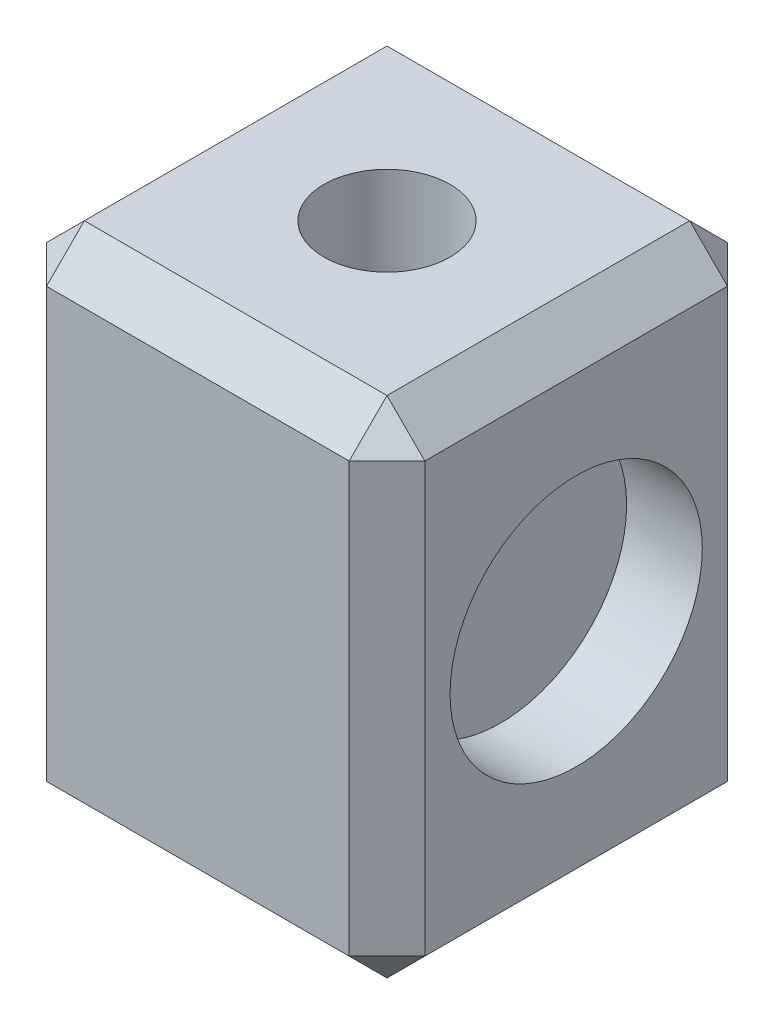
ISO-10303-21;
HEADER;
FILE_DESCRIPTION(('STEP AP214'),'2;1');
FILE_NAME('part.step','',(''),(''),'','','');
FILE_SCHEMA(('AUTOMOTIVE_DESIGN { 1 0 10303 214 1 1 1 1 }'));
ENDSEC;
DATA;
#1=APPLICATION_CONTEXT('core data for automotive mechanical design processes');
#2=APPLICATION_PROTOCOL_DEFINITION('international standard','automotive_design',2000,#1);
#3=PRODUCT_CONTEXT('',#1,'mechanical');
#4=PRODUCT('Part','Part','',(#3));
#5=PRODUCT_RELATED_PRODUCT_CATEGORY('part','',(#4));
#6=PRODUCT_DEFINITION_FORMATION('','',#4);
#7=PRODUCT_DEFINITION_CONTEXT('part definition',#1,'design');
#8=PRODUCT_DEFINITION('design','',#6,#7);
#9=PRODUCT_DEFINITION_SHAPE('','',#8);
#10=(LENGTH_UNIT() NAMED_UNIT(*) SI_UNIT(.MILLI.,.METRE.));
#11=(NAMED_UNIT(*) PLANE_ANGLE_UNIT() SI_UNIT($,.RADIAN.));
#12=(NAMED_UNIT(*) SI_UNIT($,.STERADIAN.) SOLID_ANGLE_UNIT());
#13=UNCERTAINTY_MEASURE_WITH_UNIT(LENGTH_MEASURE(1.E-05),#10,'distance_accuracy_value','');
#14=(GEOMETRIC_REPRESENTATION_CONTEXT(3) GLOBAL_UNCERTAINTY_ASSIGNED_CONTEXT((#13)) GLOBAL_UNIT_ASSIGNED_CONTEXT((#10,
#11,#12)) REPRESENTATION_CONTEXT('',''));
#15=CARTESIAN_POINT('',(0.,0.,0.));
#16=DIRECTION('',(0.,0.,1.));
#17=DIRECTION('',(1.,0.,0.));
#18=AXIS2_PLACEMENT_3D('',#15,#16,#17);
#19=CARTESIAN_POINT('',(0.,50.8,0.));
#20=DIRECTION('',(0.,-1.,0.));
#21=DIRECTION('',(0.,0.,-1.));
#22=AXIS2_PLACEMENT_3D('',#19,#20,#21);
#23=PLANE('',#22);
#24=DIRECTION('',(-1.,0.,0.));
#25=VECTOR('',#24,1.);
#26=CARTESIAN_POINT('',(0.,50.8,-15.24));
#27=LINE('',#26,#25);
#28=CARTESIAN_POINT('',(15.24,50.8,-15.24));
#29=VERTEX_POINT('',#28);
#30=CARTESIAN_POINT('',(-15.24,50.8,-15.24));
#31=VERTEX_POINT('',#30);
#32=EDGE_CURVE('E201',#29,#31,#27,.T.);
#33=ORIENTED_EDGE('',*,*,#32,.T.);
#34=DIRECTION('',(0.,0.,1.));
#35=VECTOR('',#34,1.);
#36=CARTESIAN_POINT('',(-15.24,50.8,0.));
#37=LINE('',#36,#35);
#38=CARTESIAN_POINT('',(-15.24,50.8,15.24));
#39=VERTEX_POINT('',#38);
#40=EDGE_CURVE('E11',#31,#39,#37,.T.);
#41=ORIENTED_EDGE('',*,*,#40,.T.);
#42=DIRECTION('',(1.,0.,0.));
#43=VECTOR('',#42,1.);
#44=CARTESIAN_POINT('',(0.,50.8,15.24));
#45=LINE('',#44,#43);
#46=CARTESIAN_POINT('',(15.24,50.8,15.24));
#47=VERTEX_POINT('',#46);
#48=EDGE_CURVE('E44',#39,#47,#45,.T.);
#49=ORIENTED_EDGE('',*,*,#48,.T.);
#50=DIRECTION('',(0.,0.,-1.));
#51=VECTOR('',#50,1.);
#52=CARTESIAN_POINT('',(15.24,50.8,0.));
#53=LINE('',#52,#51);
#54=EDGE_CURVE('E203',#47,#29,#53,.T.);
#55=ORIENTED_EDGE('',*,*,#54,.T.);
#56=EDGE_LOOP('',(#33,#41,#49,#55));
#57=FACE_BOUND('',#56,.T.);
#58=CARTESIAN_POINT('',(0.,50.8,0.));
#59=DIRECTION('',(0.,1.,0.));
#60=DIRECTION('',(0.,0.,1.));
#61=AXIS2_PLACEMENT_3D('',#58,#59,#60);
#62=CIRCLE('',#61,6.35);
#63=CARTESIAN_POINT('',(0.,50.8,6.35));
#64=VERTEX_POINT('',#63);
#65=EDGE_CURVE('E157',#64,#64,#62,.T.);
#66=ORIENTED_EDGE('',*,*,#65,.F.);
#67=EDGE_LOOP('',(#66));
#68=FACE_BOUND('',#67,.T.);
#69=ADVANCED_FACE('F34',(#57,#68),#23,.F.);
#70=CARTESIAN_POINT('',(0.,0.,0.));
#71=DIRECTION('',(0.,-1.,0.));
#72=DIRECTION('',(0.,0.,-1.));
#73=AXIS2_PLACEMENT_3D('',#70,#71,#72);
#74=PLANE('',#73);
#75=DIRECTION('',(0.,0.,1.));
#76=VECTOR('',#75,1.);
#77=CARTESIAN_POINT('',(15.24,0.,19.05));
#78=LINE('',#77,#76);
#79=CARTESIAN_POINT('',(15.24,0.,-15.24));
#80=VERTEX_POINT('',#79);
#81=CARTESIAN_POINT('',(15.24,0.,15.24));
#82=VERTEX_POINT('',#81);
#83=EDGE_CURVE('E165',#80,#82,#78,.T.);
#84=ORIENTED_EDGE('',*,*,#83,.T.);
#85=DIRECTION('',(-1.,0.,0.));
#86=VECTOR('',#85,1.);
#87=CARTESIAN_POINT('',(-19.05,0.,15.24));
#88=LINE('',#87,#86);
#89=CARTESIAN_POINT('',(-15.24,0.,15.24));
#90=VERTEX_POINT('',#89);
#91=EDGE_CURVE('E134',#82,#90,#88,.T.);
#92=ORIENTED_EDGE('',*,*,#91,.T.);
#93=DIRECTION('',(0.,0.,-1.));
#94=VECTOR('',#93,1.);
#95=CARTESIAN_POINT('',(-15.24,0.,-19.05));
#96=LINE('',#95,#94);
#97=CARTESIAN_POINT('',(-15.24,0.,-15.24));
#98=VERTEX_POINT('',#97);
#99=EDGE_CURVE('E171',#90,#98,#96,.T.);
#100=ORIENTED_EDGE('',*,*,#99,.T.);
#101=DIRECTION('',(1.,0.,0.));
#102=VECTOR('',#101,1.);
#103=CARTESIAN_POINT('',(19.05,0.,-15.24));
#104=LINE('',#103,#102);
#105=EDGE_CURVE('E163',#98,#80,#104,.T.);
#106=ORIENTED_EDGE('',*,*,#105,.T.);
#107=EDGE_LOOP('',(#84,#92,#100,#106));
#108=FACE_BOUND('',#107,.T.);
#109=CARTESIAN_POINT('',(0.,0.,0.));
#110=DIRECTION('',(0.,1.,0.));
#111=DIRECTION('',(0.,0.,1.));
#112=AXIS2_PLACEMENT_3D('',#109,#110,#111);
#113=CIRCLE('',#112,6.35);
#114=CARTESIAN_POINT('',(0.,0.,6.35));
#115=VERTEX_POINT('',#114);
#116=EDGE_CURVE('E276',#115,#115,#113,.T.);
#117=ORIENTED_EDGE('',*,*,#116,.T.);
#118=EDGE_LOOP('',(#117));
#119=FACE_BOUND('',#118,.T.);
#120=ADVANCED_FACE('F300',(#108,#119),#74,.T.);
#121=CARTESIAN_POINT('',(19.05,50.8,19.05));
#122=DIRECTION('',(-1.,0.,0.));
#123=DIRECTION('',(0.,0.,1.));
#124=AXIS2_PLACEMENT_3D('',#121,#122,#123);
#125=PLANE('',#124);
#126=DIRECTION('',(0.,-1.,0.));
#127=VECTOR('',#126,1.);
#128=CARTESIAN_POINT('',(19.05,50.8,15.24));
#129=LINE('',#128,#127);
#130=CARTESIAN_POINT('',(19.05,46.99,15.24));
#131=VERTEX_POINT('',#130);
#132=CARTESIAN_POINT('',(19.05,3.81000000000001,15.24));
#133=VERTEX_POINT('',#132);
#134=EDGE_CURVE('E187',#131,#133,#129,.T.);
#135=ORIENTED_EDGE('',*,*,#134,.T.);
#136=DIRECTION('',(0.,0.,-1.));
#137=VECTOR('',#136,1.);
#138=CARTESIAN_POINT('',(19.05,3.81000000000001,-19.05));
#139=LINE('',#138,#137);
#140=CARTESIAN_POINT('',(19.05,3.81000000000001,-15.24));
#141=VERTEX_POINT('',#140);
#142=EDGE_CURVE('E189',#133,#141,#139,.T.);
#143=ORIENTED_EDGE('',*,*,#142,.T.);
#144=DIRECTION('',(0.,1.,0.));
#145=VECTOR('',#144,1.);
#146=CARTESIAN_POINT('',(19.05,50.8,-15.24));
#147=LINE('',#146,#145);
#148=CARTESIAN_POINT('',(19.05,46.99,-15.24));
#149=VERTEX_POINT('',#148);
#150=EDGE_CURVE('E185',#141,#149,#147,.T.);
#151=ORIENTED_EDGE('',*,*,#150,.T.);
#152=DIRECTION('',(0.,0.,1.));
#153=VECTOR('',#152,1.);
#154=CARTESIAN_POINT('',(19.05,46.99,19.05));
#155=LINE('',#154,#153);
#156=EDGE_CURVE('E183',#149,#131,#155,.T.);
#157=ORIENTED_EDGE('',*,*,#156,.T.);
#158=EDGE_LOOP('',(#135,#143,#151,#157));
#159=FACE_BOUND('',#158,.T.);
#160=CARTESIAN_POINT('',(19.05,25.4,0.));
#161=DIRECTION('',(-1.,0.,0.));
#162=DIRECTION('',(0.,0.,1.));
#163=AXIS2_PLACEMENT_3D('',#160,#161,#162);
#164=CIRCLE('',#163,12.7);
#165=CARTESIAN_POINT('',(19.05,25.4,-12.7));
#166=VERTEX_POINT('',#165);
#167=EDGE_CURVE('E270',#166,#166,#164,.T.);
#168=ORIENTED_EDGE('',*,*,#167,.T.);
#169=EDGE_LOOP('',(#168));
#170=FACE_BOUND('',#169,.T.);
#171=ADVANCED_FACE('F309',(#159,#170),#125,.F.);
#172=CARTESIAN_POINT('',(-19.05,50.8,-19.05));
#173=DIRECTION('',(0.,0.,1.));
#174=DIRECTION('',(1.,0.,0.));
#175=AXIS2_PLACEMENT_3D('',#172,#173,#174);
#176=PLANE('',#175);
#177=DIRECTION('',(0.,-1.,0.));
#178=VECTOR('',#177,1.);
#179=CARTESIAN_POINT('',(15.24,50.8,-19.05));
#180=LINE('',#179,#178);
#181=CARTESIAN_POINT('',(15.24,46.99,-19.05));
#182=VERTEX_POINT('',#181);
#183=CARTESIAN_POINT('',(15.24,3.81000000000002,-19.05));
#184=VERTEX_POINT('',#183);
#185=EDGE_CURVE('E194',#182,#184,#180,.T.);
#186=ORIENTED_EDGE('',*,*,#185,.T.);
#187=DIRECTION('',(-1.,0.,0.));
#188=VECTOR('',#187,1.);
#189=CARTESIAN_POINT('',(-19.05,3.81000000000002,-19.05));
#190=LINE('',#189,#188);
#191=CARTESIAN_POINT('',(-15.24,3.81000000000002,-19.05));
#192=VERTEX_POINT('',#191);
#193=EDGE_CURVE('E198',#184,#192,#190,.T.);
#194=ORIENTED_EDGE('',*,*,#193,.T.);
#195=DIRECTION('',(0.,1.,0.));
#196=VECTOR('',#195,1.);
#197=CARTESIAN_POINT('',(-15.24,50.8,-19.05));
#198=LINE('',#197,#196);
#199=CARTESIAN_POINT('',(-15.24,46.99,-19.05));
#200=VERTEX_POINT('',#199);
#201=EDGE_CURVE('E196',#192,#200,#198,.T.);
#202=ORIENTED_EDGE('',*,*,#201,.T.);
#203=DIRECTION('',(1.,0.,0.));
#204=VECTOR('',#203,1.);
#205=CARTESIAN_POINT('',(-19.05,46.99,-19.05));
#206=LINE('',#205,#204);
#207=EDGE_CURVE('E192',#200,#182,#206,.T.);
#208=ORIENTED_EDGE('',*,*,#207,.T.);
#209=EDGE_LOOP('',(#186,#194,#202,#208));
#210=FACE_BOUND('',#209,.T.);
#211=ADVANCED_FACE('F346',(#210),#176,.F.);
#212=CARTESIAN_POINT('',(-19.05,50.8,19.05));
#213=DIRECTION('',(1.,0.,0.));
#214=DIRECTION('',(0.,0.,-1.));
#215=AXIS2_PLACEMENT_3D('',#212,#213,#214);
#216=PLANE('',#215);
#217=DIRECTION('',(0.,-1.,0.));
#218=VECTOR('',#217,1.);
#219=CARTESIAN_POINT('',(-19.05,50.8,-15.24));
#220=LINE('',#219,#218);
#221=CARTESIAN_POINT('',(-19.05,46.99,-15.24));
#222=VERTEX_POINT('',#221);
#223=CARTESIAN_POINT('',(-19.05,3.81000000000001,-15.24));
#224=VERTEX_POINT('',#223);
#225=EDGE_CURVE('E178',#222,#224,#220,.T.);
#226=ORIENTED_EDGE('',*,*,#225,.T.);
#227=DIRECTION('',(0.,0.,1.));
#228=VECTOR('',#227,1.);
#229=CARTESIAN_POINT('',(-19.05,3.81000000000001,19.05));
#230=LINE('',#229,#228);
#231=CARTESIAN_POINT('',(-19.05,3.81000000000001,15.24));
#232=VERTEX_POINT('',#231);
#233=EDGE_CURVE('E180',#224,#232,#230,.T.);
#234=ORIENTED_EDGE('',*,*,#233,.T.);
#235=DIRECTION('',(0.,1.,0.));
#236=VECTOR('',#235,1.);
#237=CARTESIAN_POINT('',(-19.05,50.8,15.24));
#238=LINE('',#237,#236);
#239=CARTESIAN_POINT('',(-19.05,46.99,15.24));
#240=VERTEX_POINT('',#239);
#241=EDGE_CURVE('E176',#232,#240,#238,.T.);
#242=ORIENTED_EDGE('',*,*,#241,.T.);
#243=DIRECTION('',(0.,0.,-1.));
#244=VECTOR('',#243,1.);
#245=CARTESIAN_POINT('',(-19.05,46.99,19.05));
#246=LINE('',#245,#244);
#247=EDGE_CURVE('E174',#240,#222,#246,.T.);
#248=ORIENTED_EDGE('',*,*,#247,.T.);
#249=EDGE_LOOP('',(#226,#234,#242,#248));
#250=FACE_BOUND('',#249,.T.);
#251=CARTESIAN_POINT('',(-19.05,25.4,0.));
#252=DIRECTION('',(1.,0.,0.));
#253=DIRECTION('',(0.,0.,-1.));
#254=AXIS2_PLACEMENT_3D('',#251,#252,#253);
#255=CIRCLE('',#254,12.7);
#256=CARTESIAN_POINT('',(-19.05,25.4,12.7));
#257=VERTEX_POINT('',#256);
#258=EDGE_CURVE('E259',#257,#257,#255,.T.);
#259=ORIENTED_EDGE('',*,*,#258,.T.);
#260=EDGE_LOOP('',(#259));
#261=FACE_BOUND('',#260,.T.);
#262=ADVANCED_FACE('F343',(#250,#261),#216,.F.);
#263=CARTESIAN_POINT('',(-19.05,50.8,19.05));
#264=DIRECTION('',(0.,0.,-1.));
#265=DIRECTION('',(-1.,0.,0.));
#266=AXIS2_PLACEMENT_3D('',#263,#264,#265);
#267=PLANE('',#266);
#268=DIRECTION('',(0.,-1.,0.));
#269=VECTOR('',#268,1.);
#270=CARTESIAN_POINT('',(-15.24,50.8,19.05));
#271=LINE('',#270,#269);
#272=CARTESIAN_POINT('',(-15.24,46.99,19.05));
#273=VERTEX_POINT('',#272);
#274=CARTESIAN_POINT('',(-15.24,3.81000000000001,19.05));
#275=VERTEX_POINT('',#274);
#276=EDGE_CURVE('E161',#273,#275,#271,.T.);
#277=ORIENTED_EDGE('',*,*,#276,.T.);
#278=DIRECTION('',(1.,0.,0.));
#279=VECTOR('',#278,1.);
#280=CARTESIAN_POINT('',(19.05,3.81000000000001,19.05));
#281=LINE('',#280,#279);
#282=CARTESIAN_POINT('',(15.24,3.81000000000001,19.05));
#283=VERTEX_POINT('',#282);
#284=EDGE_CURVE('E132',#275,#283,#281,.T.);
#285=ORIENTED_EDGE('',*,*,#284,.T.);
#286=DIRECTION('',(0.,1.,0.));
#287=VECTOR('',#286,1.);
#288=CARTESIAN_POINT('',(15.24,50.8,19.05));
#289=LINE('',#288,#287);
#290=CARTESIAN_POINT('',(15.24,46.99,19.05));
#291=VERTEX_POINT('',#290);
#292=EDGE_CURVE('E150',#283,#291,#289,.T.);
#293=ORIENTED_EDGE('',*,*,#292,.T.);
#294=DIRECTION('',(-1.,0.,0.));
#295=VECTOR('',#294,1.);
#296=CARTESIAN_POINT('',(-19.05,46.99,19.05));
#297=LINE('',#296,#295);
#298=EDGE_CURVE('E156',#291,#273,#297,.T.);
#299=ORIENTED_EDGE('',*,*,#298,.T.);
#300=EDGE_LOOP('',(#277,#285,#293,#299));
#301=FACE_BOUND('',#300,.T.);
#302=ADVANCED_FACE('F159',(#301),#267,.F.);
#303=CARTESIAN_POINT('',(0.,50.8,0.));
#304=DIRECTION('',(0.,-1.,0.));
#305=DIRECTION('',(0.,0.,-1.));
#306=AXIS2_PLACEMENT_3D('',#303,#304,#305);
#307=CYLINDRICAL_SURFACE('',#306,6.35);
#308=ORIENTED_EDGE('',*,*,#65,.T.);
#309=EDGE_LOOP('',(#308));
#310=FACE_BOUND('',#309,.T.);
#311=ORIENTED_EDGE('',*,*,#116,.F.);
#312=EDGE_LOOP('',(#311));
#313=FACE_BOUND('',#312,.T.);
#314=ADVANCED_FACE('F338',(#310,#313),#307,.F.);
#315=CARTESIAN_POINT('',(11.43,25.4,0.));
#316=DIRECTION('',(1.,0.,0.));
#317=DIRECTION('',(0.,0.,-1.));
#318=AXIS2_PLACEMENT_3D('',#315,#316,#317);
#319=CYLINDRICAL_SURFACE('',#318,12.7);
#320=CARTESIAN_POINT('',(11.43,25.4,0.));
#321=DIRECTION('',(-1.,0.,0.));
#322=DIRECTION('',(0.,0.,1.));
#323=AXIS2_PLACEMENT_3D('',#320,#321,#322);
#324=CIRCLE('',#323,12.7);
#325=CARTESIAN_POINT('',(11.43,25.4,-12.7));
#326=VERTEX_POINT('',#325);
#327=EDGE_CURVE('E273',#326,#326,#324,.T.);
#328=CARTESIAN_POINT('',(11.43,25.4,-12.7));
#329=CARTESIAN_POINT('',(11.509375,25.4,-12.7));
#330=CARTESIAN_POINT('',(11.58875,25.4,-12.7));
#331=CARTESIAN_POINT('',(11.7475,25.4,-12.7));
#332=CARTESIAN_POINT('',(11.826875,25.4,-12.7));
#333=CARTESIAN_POINT('',(11.985625,25.4,-12.7));
#334=CARTESIAN_POINT('',(12.065,25.4,-12.7));
#335=CARTESIAN_POINT('',(12.22375,25.4,-12.7));
#336=CARTESIAN_POINT('',(12.303125,25.4,-12.7));
#337=CARTESIAN_POINT('',(12.461875,25.4,-12.7));
#338=CARTESIAN_POINT('',(12.54125,25.4,-12.7));
#339=CARTESIAN_POINT('',(12.7,25.4,-12.7));
#340=CARTESIAN_POINT('',(12.779375,25.4,-12.7));
#341=CARTESIAN_POINT('',(12.938125,25.4,-12.7));
#342=CARTESIAN_POINT('',(13.0175,25.4,-12.7));
#343=CARTESIAN_POINT('',(13.17625,25.4,-12.7));
#344=CARTESIAN_POINT('',(13.255625,25.4,-12.7));
#345=CARTESIAN_POINT('',(13.414375,25.4,-12.7));
#346=CARTESIAN_POINT('',(13.49375,25.4,-12.7));
#347=CARTESIAN_POINT('',(13.6525,25.4,-12.7));
#348=CARTESIAN_POINT('',(13.731875,25.4,-12.7));
#349=CARTESIAN_POINT('',(13.890625,25.4,-12.7));
#350=CARTESIAN_POINT('',(13.97,25.4,-12.7));
#351=CARTESIAN_POINT('',(14.12875,25.4,-12.7));
#352=CARTESIAN_POINT('',(14.208125,25.4,-12.7));
#353=CARTESIAN_POINT('',(14.366875,25.4,-12.7));
#354=CARTESIAN_POINT('',(14.44625,25.4,-12.7));
#355=CARTESIAN_POINT('',(14.605,25.4,-12.7));
#356=CARTESIAN_POINT('',(14.684375,25.4,-12.7));
#357=CARTESIAN_POINT('',(14.843125,25.4,-12.7));
#358=CARTESIAN_POINT('',(14.9225,25.4,-12.7));
#359=CARTESIAN_POINT('',(15.08125,25.4,-12.7));
#360=CARTESIAN_POINT('',(15.160625,25.4,-12.7));
#361=CARTESIAN_POINT('',(15.319375,25.4,-12.7));
#362=CARTESIAN_POINT('',(15.39875,25.4,-12.7));
#363=CARTESIAN_POINT('',(15.5575,25.4,-12.7));
#364=CARTESIAN_POINT('',(15.636875,25.4,-12.7));
#365=CARTESIAN_POINT('',(15.795625,25.4,-12.7));
#366=CARTESIAN_POINT('',(15.875,25.4,-12.7));
#367=CARTESIAN_POINT('',(16.03375,25.4,-12.7));
#368=CARTESIAN_POINT('',(16.113125,25.4,-12.7));
#369=CARTESIAN_POINT('',(16.271875,25.4,-12.7));
#370=CARTESIAN_POINT('',(16.35125,25.4,-12.7));
#371=CARTESIAN_POINT('',(16.51,25.4,-12.7));
#372=CARTESIAN_POINT('',(16.589375,25.4,-12.7));
#373=CARTESIAN_POINT('',(16.748125,25.4,-12.7));
#374=CARTESIAN_POINT('',(16.8275,25.4,-12.7));
#375=CARTESIAN_POINT('',(16.98625,25.4,-12.7));
#376=CARTESIAN_POINT('',(17.065625,25.4,-12.7));
#377=CARTESIAN_POINT('',(17.224375,25.4,-12.7));
#378=CARTESIAN_POINT('',(17.30375,25.4,-12.7));
#379=CARTESIAN_POINT('',(17.4625,25.4,-12.7));
#380=CARTESIAN_POINT('',(17.541875,25.4,-12.7));
#381=CARTESIAN_POINT('',(17.700625,25.4,-12.7));
#382=CARTESIAN_POINT('',(17.78,25.4,-12.7));
#383=CARTESIAN_POINT('',(17.93875,25.4,-12.7));
#384=CARTESIAN_POINT('',(18.018125,25.4,-12.7));
#385=CARTESIAN_POINT('',(18.176875,25.4,-12.7));
#386=CARTESIAN_POINT('',(18.25625,25.4,-12.7));
#387=CARTESIAN_POINT('',(18.415,25.4,-12.7));
#388=CARTESIAN_POINT('',(18.494375,25.4,-12.7));
#389=CARTESIAN_POINT('',(18.653125,25.4,-12.7));
#390=CARTESIAN_POINT('',(18.7325,25.4,-12.7));
#391=CARTESIAN_POINT('',(18.89125,25.4,-12.7));
#392=CARTESIAN_POINT('',(18.970625,25.4,-12.7));
#393=CARTESIAN_POINT('',(19.05,25.4,-12.7));
#394=B_SPLINE_CURVE_WITH_KNOTS('',3,(#328,#329,#330,#331,#332,#333,#334,#335,#336,#337,#338,
#339,#340,#341,#342,#343,#344,#345,#346,#347,#348,#349,#350,#351,#352,#353,#354,#355,#356,#357,
#358,#359,#360,#361,#362,#363,#364,#365,#366,#367,#368,#369,#370,#371,#372,#373,#374,#375,#376,
#377,#378,#379,#380,#381,#382,#383,#384,#385,#386,#387,#388,#389,#390,#391,#392,#393),
.UNSPECIFIED.,.F.,.F.,(4,2,2,2,2,2,2,2,2,2,2,2,2,2,2,2,2,2,2,2,2,2,2,2,2,2,2,2,2,2,2,2,4),(0.,
0.238125,0.476250000000001,0.714375000000001,0.9525,1.190625,1.42875,1.666875,1.905,2.143125,
2.38125,2.619375,2.8575,3.095625,3.33375,3.571875,3.81,4.048125,4.28625,4.524375,4.7625,
5.000625,5.23875,5.476875,5.715,5.953125,6.19125,6.429375,6.6675,6.905625,7.14375,7.381875,
7.62),.UNSPECIFIED.);
#395=EDGE_CURVE('BSEAM556',#326,#166,#394,.T.);
#396=ORIENTED_EDGE('',*,*,#327,.T.);
#397=ORIENTED_EDGE('',*,*,#167,.F.);
#398=ORIENTED_EDGE('',*,*,#395,.T.);
#399=ORIENTED_EDGE('',*,*,#395,.F.);
#400=EDGE_LOOP('',(#396,#398,#397,#399));
#401=FACE_BOUND('',#400,.T.);
#402=ADVANCED_FACE('F556',(#401),#319,.F.);
#403=CARTESIAN_POINT('',(11.43,25.4,0.));
#404=DIRECTION('',(-1.,0.,0.));
#405=DIRECTION('',(0.,0.,1.));
#406=AXIS2_PLACEMENT_3D('',#403,#404,#405);
#407=PLANE('',#406);
#408=ORIENTED_EDGE('',*,*,#327,.F.);
#409=EDGE_LOOP('',(#408));
#410=FACE_BOUND('',#409,.T.);
#411=ADVANCED_FACE('F546',(#410),#407,.F.);
#412=CARTESIAN_POINT('',(-11.43,25.4,0.));
#413=DIRECTION('',(-1.,0.,0.));
#414=DIRECTION('',(0.,0.,1.));
#415=AXIS2_PLACEMENT_3D('',#412,#413,#414);
#416=CYLINDRICAL_SURFACE('',#415,12.7);
#417=CARTESIAN_POINT('',(-11.43,25.4,0.));
#418=DIRECTION('',(1.,0.,0.));
#419=DIRECTION('',(0.,0.,-1.));
#420=AXIS2_PLACEMENT_3D('',#417,#418,#419);
#421=CIRCLE('',#420,12.7);
#422=CARTESIAN_POINT('',(-11.43,25.4,12.7));
#423=VERTEX_POINT('',#422);
#424=EDGE_CURVE('E265',#423,#423,#421,.T.);
#425=CARTESIAN_POINT('',(-11.43,25.4,12.7));
#426=CARTESIAN_POINT('',(-11.509375,25.4,12.7));
#427=CARTESIAN_POINT('',(-11.58875,25.4,12.7));
#428=CARTESIAN_POINT('',(-11.7475,25.4,12.7));
#429=CARTESIAN_POINT('',(-11.826875,25.4,12.7));
#430=CARTESIAN_POINT('',(-11.985625,25.4,12.7));
#431=CARTESIAN_POINT('',(-12.065,25.4,12.7));
#432=CARTESIAN_POINT('',(-12.22375,25.4,12.7));
#433=CARTESIAN_POINT('',(-12.303125,25.4,12.7));
#434=CARTESIAN_POINT('',(-12.461875,25.4,12.7));
#435=CARTESIAN_POINT('',(-12.54125,25.4,12.7));
#436=CARTESIAN_POINT('',(-12.7,25.4,12.7));
#437=CARTESIAN_POINT('',(-12.779375,25.4,12.7));
#438=CARTESIAN_POINT('',(-12.938125,25.4,12.7));
#439=CARTESIAN_POINT('',(-13.0175,25.4,12.7));
#440=CARTESIAN_POINT('',(-13.17625,25.4,12.7));
#441=CARTESIAN_POINT('',(-13.255625,25.4,12.7));
#442=CARTESIAN_POINT('',(-13.414375,25.4,12.7));
#443=CARTESIAN_POINT('',(-13.49375,25.4,12.7));
#444=CARTESIAN_POINT('',(-13.6525,25.4,12.7));
#445=CARTESIAN_POINT('',(-13.731875,25.4,12.7));
#446=CARTESIAN_POINT('',(-13.890625,25.4,12.7));
#447=CARTESIAN_POINT('',(-13.97,25.4,12.7));
#448=CARTESIAN_POINT('',(-14.12875,25.4,12.7));
#449=CARTESIAN_POINT('',(-14.208125,25.4,12.7));
#450=CARTESIAN_POINT('',(-14.366875,25.4,12.7));
#451=CARTESIAN_POINT('',(-14.44625,25.4,12.7));
#452=CARTESIAN_POINT('',(-14.605,25.4,12.7));
#453=CARTESIAN_POINT('',(-14.684375,25.4,12.7));
#454=CARTESIAN_POINT('',(-14.843125,25.4,12.7));
#455=CARTESIAN_POINT('',(-14.9225,25.4,12.7));
#456=CARTESIAN_POINT('',(-15.08125,25.4,12.7));
#457=CARTESIAN_POINT('',(-15.160625,25.4,12.7));
#458=CARTESIAN_POINT('',(-15.319375,25.4,12.7));
#459=CARTESIAN_POINT('',(-15.39875,25.4,12.7));
#460=CARTESIAN_POINT('',(-15.5575,25.4,12.7));
#461=CARTESIAN_POINT('',(-15.636875,25.4,12.7));
#462=CARTESIAN_POINT('',(-15.795625,25.4,12.7));
#463=CARTESIAN_POINT('',(-15.875,25.4,12.7));
#464=CARTESIAN_POINT('',(-16.03375,25.4,12.7));
#465=CARTESIAN_POINT('',(-16.113125,25.4,12.7));
#466=CARTESIAN_POINT('',(-16.271875,25.4,12.7));
#467=CARTESIAN_POINT('',(-16.35125,25.4,12.7));
#468=CARTESIAN_POINT('',(-16.51,25.4,12.7));
#469=CARTESIAN_POINT('',(-16.589375,25.4,12.7));
#470=CARTESIAN_POINT('',(-16.748125,25.4,12.7));
#471=CARTESIAN_POINT('',(-16.8275,25.4,12.7));
#472=CARTESIAN_POINT('',(-16.98625,25.4,12.7));
#473=CARTESIAN_POINT('',(-17.065625,25.4,12.7));
#474=CARTESIAN_POINT('',(-17.224375,25.4,12.7));
#475=CARTESIAN_POINT('',(-17.30375,25.4,12.7));
#476=CARTESIAN_POINT('',(-17.4625,25.4,12.7));
#477=CARTESIAN_POINT('',(-17.541875,25.4,12.7));
#478=CARTESIAN_POINT('',(-17.700625,25.4,12.7));
#479=CARTESIAN_POINT('',(-17.78,25.4,12.7));
#480=CARTESIAN_POINT('',(-17.93875,25.4,12.7));
#481=CARTESIAN_POINT('',(-18.018125,25.4,12.7));
#482=CARTESIAN_POINT('',(-18.176875,25.4,12.7));
#483=CARTESIAN_POINT('',(-18.25625,25.4,12.7));
#484=CARTESIAN_POINT('',(-18.415,25.4,12.7));
#485=CARTESIAN_POINT('',(-18.494375,25.4,12.7));
#486=CARTESIAN_POINT('',(-18.653125,25.4,12.7));
#487=CARTESIAN_POINT('',(-18.7325,25.4,12.7));
#488=CARTESIAN_POINT('',(-18.89125,25.4,12.7));
#489=CARTESIAN_POINT('',(-18.970625,25.4,12.7));
#490=CARTESIAN_POINT('',(-19.05,25.4,12.7));
#491=B_SPLINE_CURVE_WITH_KNOTS('',3,(#425,#426,#427,#428,#429,#430,#431,#432,#433,#434,#435,
#436,#437,#438,#439,#440,#441,#442,#443,#444,#445,#446,#447,#448,#449,#450,#451,#452,#453,#454,
#455,#456,#457,#458,#459,#460,#461,#462,#463,#464,#465,#466,#467,#468,#469,#470,#471,#472,#473,
#474,#475,#476,#477,#478,#479,#480,#481,#482,#483,#484,#485,#486,#487,#488,#489,#490),
.UNSPECIFIED.,.F.,.F.,(4,2,2,2,2,2,2,2,2,2,2,2,2,2,2,2,2,2,2,2,2,2,2,2,2,2,2,2,2,2,2,2,4),(0.,
0.238125,0.476250000000001,0.714375000000001,0.9525,1.190625,1.42875,1.666875,1.905,2.143125,
2.38125,2.619375,2.8575,3.095625,3.33375,3.571875,3.81,4.048125,4.28625,4.524375,4.7625,
5.000625,5.23875,5.476875,5.715,5.953125,6.19125,6.429375,6.6675,6.905625,7.14375,7.381875,
7.62),.UNSPECIFIED.);
#492=EDGE_CURVE('BSEAM536',#423,#257,#491,.T.);
#493=ORIENTED_EDGE('',*,*,#424,.T.);
#494=ORIENTED_EDGE('',*,*,#258,.F.);
#495=ORIENTED_EDGE('',*,*,#492,.T.);
#496=ORIENTED_EDGE('',*,*,#492,.F.);
#497=EDGE_LOOP('',(#493,#495,#494,#496));
#498=FACE_BOUND('',#497,.T.);
#499=ADVANCED_FACE('F536',(#498),#416,.F.);
#500=CARTESIAN_POINT('',(-11.43,25.4,0.));
#501=DIRECTION('',(1.,0.,0.));
#502=DIRECTION('',(0.,0.,-1.));
#503=AXIS2_PLACEMENT_3D('',#500,#501,#502);
#504=PLANE('',#503);
#505=ORIENTED_EDGE('',*,*,#424,.F.);
#506=EDGE_LOOP('',(#505));
#507=FACE_BOUND('',#506,.T.);
#508=ADVANCED_FACE('F443',(#507),#504,.F.);
#509=CARTESIAN_POINT('',(0.,50.8,-15.24));
#510=DIRECTION('',(0.,-0.707106781186547,0.707106781186548));
#511=DIRECTION('',(-1.,0.,0.));
#512=AXIS2_PLACEMENT_3D('',#509,#510,#511);
#513=PLANE('',#512);
#514=DIRECTION('',(0.,0.707106781186548,0.707106781186547));
#515=VECTOR('',#514,1.);
#516=CARTESIAN_POINT('',(-15.24,46.99,-19.05));
#517=LINE('',#516,#515);
#518=EDGE_CURVE('E39',#31,#200,#517,.F.);
#519=ORIENTED_EDGE('',*,*,#518,.F.);
#520=ORIENTED_EDGE('',*,*,#32,.F.);
#521=DIRECTION('',(0.,-0.707106781186548,-0.707106781186547));
#522=VECTOR('',#521,1.);
#523=CARTESIAN_POINT('',(15.24,48.895,-17.145));
#524=LINE('',#523,#522);
#525=EDGE_CURVE('E252',#182,#29,#524,.F.);
#526=ORIENTED_EDGE('',*,*,#525,.F.);
#527=ORIENTED_EDGE('',*,*,#207,.F.);
#528=EDGE_LOOP('',(#519,#520,#526,#527));
#529=FACE_BOUND('',#528,.T.);
#530=ADVANCED_FACE('F37',(#529),#513,.F.);
#531=CARTESIAN_POINT('',(-15.24,46.99,-19.05));
#532=DIRECTION('',(-0.577350269189626,0.577350269189625,-0.577350269189627));
#533=DIRECTION('',(-0.707106781186548,0.,0.707106781186547));
#534=AXIS2_PLACEMENT_3D('',#531,#532,#533);
#535=PLANE('',#534);
#536=DIRECTION('',(-0.707106781186547,-0.707106781186548,0.));
#537=VECTOR('',#536,1.);
#538=CARTESIAN_POINT('',(-17.145,48.895,-15.24));
#539=LINE('',#538,#537);
#540=EDGE_CURVE('E247',#31,#222,#539,.T.);
#541=ORIENTED_EDGE('',*,*,#540,.F.);
#542=ORIENTED_EDGE('',*,*,#518,.T.);
#543=DIRECTION('',(0.707106781186548,0.,-0.707106781186547));
#544=VECTOR('',#543,1.);
#545=CARTESIAN_POINT('',(-15.24,46.99,-19.05));
#546=LINE('',#545,#544);
#547=EDGE_CURVE('E250',#222,#200,#546,.T.);
#548=ORIENTED_EDGE('',*,*,#547,.F.);
#549=EDGE_LOOP('',(#541,#542,#548));
#550=FACE_BOUND('',#549,.T.);
#551=ADVANCED_FACE('F435',(#550),#535,.T.);
#552=CARTESIAN_POINT('',(19.05,46.99,-15.24));
#553=DIRECTION('',(0.577350269189626,0.577350269189625,-0.577350269189627));
#554=DIRECTION('',(-0.707106781186548,0.,-0.707106781186547));
#555=AXIS2_PLACEMENT_3D('',#552,#553,#554);
#556=PLANE('',#555);
#557=DIRECTION('',(0.707106781186548,0.,0.707106781186547));
#558=VECTOR('',#557,1.);
#559=CARTESIAN_POINT('',(19.05,46.99,-15.24));
#560=LINE('',#559,#558);
#561=EDGE_CURVE('E241',#182,#149,#560,.T.);
#562=ORIENTED_EDGE('',*,*,#561,.F.);
#563=ORIENTED_EDGE('',*,*,#525,.T.);
#564=DIRECTION('',(-0.707106781186547,0.707106781186548,0.));
#565=VECTOR('',#564,1.);
#566=CARTESIAN_POINT('',(19.05,46.99,-15.24));
#567=LINE('',#566,#565);
#568=EDGE_CURVE('E244',#149,#29,#567,.T.);
#569=ORIENTED_EDGE('',*,*,#568,.F.);
#570=EDGE_LOOP('',(#562,#563,#569));
#571=FACE_BOUND('',#570,.T.);
#572=ADVANCED_FACE('F432',(#571),#556,.T.);
#573=CARTESIAN_POINT('',(-19.05,50.8,-15.24));
#574=DIRECTION('',(0.707106781186547,0.,0.707106781186548));
#575=DIRECTION('',(0.,-1.,0.));
#576=AXIS2_PLACEMENT_3D('',#573,#574,#575);
#577=PLANE('',#576);
#578=ORIENTED_EDGE('',*,*,#547,.T.);
#579=ORIENTED_EDGE('',*,*,#201,.F.);
#580=DIRECTION('',(-0.707106781186548,0.,0.707106781186547));
#581=VECTOR('',#580,1.);
#582=CARTESIAN_POINT('',(-17.145,3.81000000000002,-17.145));
#583=LINE('',#582,#581);
#584=EDGE_CURVE('E236',#224,#192,#583,.F.);
#585=ORIENTED_EDGE('',*,*,#584,.F.);
#586=ORIENTED_EDGE('',*,*,#225,.F.);
#587=EDGE_LOOP('',(#578,#579,#585,#586));
#588=FACE_BOUND('',#587,.T.);
#589=ADVANCED_FACE('F427',(#588),#577,.F.);
#590=CARTESIAN_POINT('',(-15.24,50.8,0.));
#591=DIRECTION('',(0.707106781186548,-0.707106781186547,0.));
#592=DIRECTION('',(0.,0.,1.));
#593=AXIS2_PLACEMENT_3D('',#590,#591,#592);
#594=PLANE('',#593);
#595=ORIENTED_EDGE('',*,*,#540,.T.);
#596=ORIENTED_EDGE('',*,*,#247,.F.);
#597=DIRECTION('',(0.707106781186547,0.707106781186548,0.));
#598=VECTOR('',#597,1.);
#599=CARTESIAN_POINT('',(-19.05,46.99,15.24));
#600=LINE('',#599,#598);
#601=EDGE_CURVE('E234',#39,#240,#600,.F.);
#602=ORIENTED_EDGE('',*,*,#601,.F.);
#603=ORIENTED_EDGE('',*,*,#40,.F.);
#604=EDGE_LOOP('',(#595,#596,#602,#603));
#605=FACE_BOUND('',#604,.T.);
#606=ADVANCED_FACE('F422',(#605),#594,.F.);
#607=CARTESIAN_POINT('',(0.,50.8,15.24));
#608=DIRECTION('',(0.,-0.707106781186547,-0.707106781186548));
#609=DIRECTION('',(1.,0.,0.));
#610=AXIS2_PLACEMENT_3D('',#607,#608,#609);
#611=PLANE('',#610);
#612=DIRECTION('',(0.,0.707106781186548,-0.707106781186547));
#613=VECTOR('',#612,1.);
#614=CARTESIAN_POINT('',(15.24,50.8,15.24));
#615=LINE('',#614,#613);
#616=EDGE_CURVE('E230',#47,#291,#615,.F.);
#617=ORIENTED_EDGE('',*,*,#616,.F.);
#618=ORIENTED_EDGE('',*,*,#48,.F.);
#619=DIRECTION('',(0.,-0.707106781186548,0.707106781186547));
#620=VECTOR('',#619,1.);
#621=CARTESIAN_POINT('',(-15.24,48.895,17.145));
#622=LINE('',#621,#620);
#623=EDGE_CURVE('E52',#273,#39,#622,.F.);
#624=ORIENTED_EDGE('',*,*,#623,.F.);
#625=ORIENTED_EDGE('',*,*,#298,.F.);
#626=EDGE_LOOP('',(#617,#618,#624,#625));
#627=FACE_BOUND('',#626,.T.);
#628=ADVANCED_FACE('F284',(#627),#611,.F.);
#629=CARTESIAN_POINT('',(15.24,50.8,0.));
#630=DIRECTION('',(-0.707106781186548,-0.707106781186547,0.));
#631=DIRECTION('',(0.,0.,-1.));
#632=AXIS2_PLACEMENT_3D('',#629,#630,#631);
#633=PLANE('',#632);
#634=ORIENTED_EDGE('',*,*,#568,.T.);
#635=ORIENTED_EDGE('',*,*,#54,.F.);
#636=DIRECTION('',(0.707106781186547,-0.707106781186548,0.));
#637=VECTOR('',#636,1.);
#638=CARTESIAN_POINT('',(15.24,50.8,15.24));
#639=LINE('',#638,#637);
#640=EDGE_CURVE('E227',#131,#47,#639,.F.);
#641=ORIENTED_EDGE('',*,*,#640,.F.);
#642=ORIENTED_EDGE('',*,*,#156,.F.);
#643=EDGE_LOOP('',(#634,#635,#641,#642));
#644=FACE_BOUND('',#643,.T.);
#645=ADVANCED_FACE('F315',(#644),#633,.F.);
#646=CARTESIAN_POINT('',(15.24,50.8,-19.05));
#647=DIRECTION('',(-0.707106781186547,0.,0.707106781186548));
#648=DIRECTION('',(0.,-1.,0.));
#649=AXIS2_PLACEMENT_3D('',#646,#647,#648);
#650=PLANE('',#649);
#651=ORIENTED_EDGE('',*,*,#561,.T.);
#652=ORIENTED_EDGE('',*,*,#150,.F.);
#653=DIRECTION('',(-0.707106781186548,0.,-0.707106781186547));
#654=VECTOR('',#653,1.);
#655=CARTESIAN_POINT('',(19.05,3.81000000000001,-15.24));
#656=LINE('',#655,#654);
#657=EDGE_CURVE('E224',#184,#141,#656,.F.);
#658=ORIENTED_EDGE('',*,*,#657,.F.);
#659=ORIENTED_EDGE('',*,*,#185,.F.);
#660=EDGE_LOOP('',(#651,#652,#658,#659));
#661=FACE_BOUND('',#660,.T.);
#662=ADVANCED_FACE('F409',(#661),#650,.F.);
#663=CARTESIAN_POINT('',(-19.05,3.81000000000002,-19.05));
#664=DIRECTION('',(0.,-0.707106781186547,-0.707106781186548));
#665=DIRECTION('',(1.,0.,0.));
#666=AXIS2_PLACEMENT_3D('',#663,#664,#665);
#667=PLANE('',#666);
#668=DIRECTION('',(0.,-0.707106781186548,0.707106781186547));
#669=VECTOR('',#668,1.);
#670=CARTESIAN_POINT('',(-15.24,0.,-15.24));
#671=LINE('',#670,#669);
#672=EDGE_CURVE('E238',#192,#98,#671,.T.);
#673=ORIENTED_EDGE('',*,*,#672,.F.);
#674=ORIENTED_EDGE('',*,*,#193,.F.);
#675=DIRECTION('',(0.,0.707106781186548,-0.707106781186547));
#676=VECTOR('',#675,1.);
#677=CARTESIAN_POINT('',(15.24,1.90500000000001,-17.145));
#678=LINE('',#677,#676);
#679=EDGE_CURVE('E221',#80,#184,#678,.T.);
#680=ORIENTED_EDGE('',*,*,#679,.F.);
#681=ORIENTED_EDGE('',*,*,#105,.F.);
#682=EDGE_LOOP('',(#673,#674,#680,#681));
#683=FACE_BOUND('',#682,.T.);
#684=ADVANCED_FACE('F404',(#683),#667,.T.);
#685=CARTESIAN_POINT('',(-15.24,0.,-15.24));
#686=DIRECTION('',(-0.577350269189625,-0.577350269189626,-0.577350269189627));
#687=DIRECTION('',(0.,0.707106781186548,-0.707106781186547));
#688=AXIS2_PLACEMENT_3D('',#685,#686,#687);
#689=PLANE('',#688);
#690=ORIENTED_EDGE('',*,*,#584,.T.);
#691=ORIENTED_EDGE('',*,*,#672,.T.);
#692=DIRECTION('',(-0.707106781186548,0.707106781186547,0.));
#693=VECTOR('',#692,1.);
#694=CARTESIAN_POINT('',(-15.24,0.,-15.24));
#695=LINE('',#694,#693);
#696=EDGE_CURVE('E218',#224,#98,#695,.F.);
#697=ORIENTED_EDGE('',*,*,#696,.F.);
#698=EDGE_LOOP('',(#690,#691,#697));
#699=FACE_BOUND('',#698,.T.);
#700=ADVANCED_FACE('F327',(#699),#689,.T.);
#701=CARTESIAN_POINT('',(-19.05,46.99,15.24));
#702=DIRECTION('',(-0.577350269189627,0.577350269189625,0.577350269189626));
#703=DIRECTION('',(0.707106781186547,0.,0.707106781186548));
#704=AXIS2_PLACEMENT_3D('',#701,#702,#703);
#705=PLANE('',#704);
#706=ORIENTED_EDGE('',*,*,#623,.T.);
#707=ORIENTED_EDGE('',*,*,#601,.T.);
#708=DIRECTION('',(-0.707106781186547,0.,-0.707106781186548));
#709=VECTOR('',#708,1.);
#710=CARTESIAN_POINT('',(-19.05,46.99,15.24));
#711=LINE('',#710,#709);
#712=EDGE_CURVE('E215',#273,#240,#711,.T.);
#713=ORIENTED_EDGE('',*,*,#712,.F.);
#714=EDGE_LOOP('',(#706,#707,#713));
#715=FACE_BOUND('',#714,.T.);
#716=ADVANCED_FACE('F285',(#715),#705,.T.);
#717=CARTESIAN_POINT('',(15.24,50.8,15.24));
#718=DIRECTION('',(0.577350269189626,0.577350269189625,0.577350269189627));
#719=DIRECTION('',(0.707106781186548,0.,-0.707106781186547));
#720=AXIS2_PLACEMENT_3D('',#717,#718,#719);
#721=PLANE('',#720);
#722=ORIENTED_EDGE('',*,*,#640,.T.);
#723=ORIENTED_EDGE('',*,*,#616,.T.);
#724=DIRECTION('',(-0.707106781186548,0.,0.707106781186547));
#725=VECTOR('',#724,1.);
#726=CARTESIAN_POINT('',(17.145,46.99,17.145));
#727=LINE('',#726,#725);
#728=EDGE_CURVE('E153',#131,#291,#727,.T.);
#729=ORIENTED_EDGE('',*,*,#728,.F.);
#730=EDGE_LOOP('',(#722,#723,#729));
#731=FACE_BOUND('',#730,.T.);
#732=ADVANCED_FACE('F317',(#731),#721,.T.);
#733=CARTESIAN_POINT('',(19.05,3.81000000000001,-15.24));
#734=DIRECTION('',(0.577350269189625,-0.577350269189626,-0.577350269189627));
#735=DIRECTION('',(0.,0.707106781186548,-0.707106781186547));
#736=AXIS2_PLACEMENT_3D('',#733,#734,#735);
#737=PLANE('',#736);
#738=ORIENTED_EDGE('',*,*,#679,.T.);
#739=ORIENTED_EDGE('',*,*,#657,.T.);
#740=DIRECTION('',(-0.707106781186548,-0.707106781186547,0.));
#741=VECTOR('',#740,1.);
#742=CARTESIAN_POINT('',(19.05,3.81000000000001,-15.24));
#743=LINE('',#742,#741);
#744=EDGE_CURVE('E212',#80,#141,#743,.F.);
#745=ORIENTED_EDGE('',*,*,#744,.F.);
#746=EDGE_LOOP('',(#738,#739,#745));
#747=FACE_BOUND('',#746,.T.);
#748=ADVANCED_FACE('F319',(#747),#737,.T.);
#749=CARTESIAN_POINT('',(-19.05,3.81000000000001,19.05));
#750=DIRECTION('',(-0.707106781186547,-0.707106781186548,0.));
#751=DIRECTION('',(0.,0.,-1.));
#752=AXIS2_PLACEMENT_3D('',#749,#750,#751);
#753=PLANE('',#752);
#754=ORIENTED_EDGE('',*,*,#696,.T.);
#755=ORIENTED_EDGE('',*,*,#99,.F.);
#756=DIRECTION('',(0.707106781186548,-0.707106781186547,0.));
#757=VECTOR('',#756,1.);
#758=CARTESIAN_POINT('',(-15.24,0.,15.24));
#759=LINE('',#758,#757);
#760=EDGE_CURVE('E209',#232,#90,#759,.T.);
#761=ORIENTED_EDGE('',*,*,#760,.F.);
#762=ORIENTED_EDGE('',*,*,#233,.F.);
#763=EDGE_LOOP('',(#754,#755,#761,#762));
#764=FACE_BOUND('',#763,.T.);
#765=ADVANCED_FACE('F296',(#764),#753,.T.);
#766=CARTESIAN_POINT('',(-15.24,50.8,19.05));
#767=DIRECTION('',(0.707106781186548,0.,-0.707106781186547));
#768=DIRECTION('',(0.,-1.,0.));
#769=AXIS2_PLACEMENT_3D('',#766,#767,#768);
#770=PLANE('',#769);
#771=ORIENTED_EDGE('',*,*,#712,.T.);
#772=ORIENTED_EDGE('',*,*,#241,.F.);
#773=DIRECTION('',(0.707106781186547,0.,0.707106781186548));
#774=VECTOR('',#773,1.);
#775=CARTESIAN_POINT('',(-17.145,3.81000000000001,17.145));
#776=LINE('',#775,#774);
#777=EDGE_CURVE('E147',#275,#232,#776,.F.);
#778=ORIENTED_EDGE('',*,*,#777,.F.);
#779=ORIENTED_EDGE('',*,*,#276,.F.);
#780=EDGE_LOOP('',(#771,#772,#778,#779));
#781=FACE_BOUND('',#780,.T.);
#782=ADVANCED_FACE('F288',(#781),#770,.F.);
#783=CARTESIAN_POINT('',(19.05,50.8,15.24));
#784=DIRECTION('',(-0.707106781186547,0.,-0.707106781186548));
#785=DIRECTION('',(0.,-1.,0.));
#786=AXIS2_PLACEMENT_3D('',#783,#784,#785);
#787=PLANE('',#786);
#788=ORIENTED_EDGE('',*,*,#728,.T.);
#789=ORIENTED_EDGE('',*,*,#292,.F.);
#790=DIRECTION('',(0.707106781186548,0.,-0.707106781186547));
#791=VECTOR('',#790,1.);
#792=CARTESIAN_POINT('',(15.24,3.81000000000001,19.05));
#793=LINE('',#792,#791);
#794=EDGE_CURVE('E140',#133,#283,#793,.F.);
#795=ORIENTED_EDGE('',*,*,#794,.F.);
#796=ORIENTED_EDGE('',*,*,#134,.F.);
#797=EDGE_LOOP('',(#788,#789,#795,#796));
#798=FACE_BOUND('',#797,.T.);
#799=ADVANCED_FACE('F151',(#798),#787,.F.);
#800=CARTESIAN_POINT('',(19.05,3.81000000000001,19.05));
#801=DIRECTION('',(0.707106781186547,-0.707106781186548,0.));
#802=DIRECTION('',(0.,0.,1.));
#803=AXIS2_PLACEMENT_3D('',#800,#801,#802);
#804=PLANE('',#803);
#805=ORIENTED_EDGE('',*,*,#744,.T.);
#806=ORIENTED_EDGE('',*,*,#142,.F.);
#807=DIRECTION('',(0.707106781186548,0.707106781186547,0.));
#808=VECTOR('',#807,1.);
#809=CARTESIAN_POINT('',(17.145,1.90500000000001,15.24));
#810=LINE('',#809,#808);
#811=EDGE_CURVE('E144',#82,#133,#810,.T.);
#812=ORIENTED_EDGE('',*,*,#811,.F.);
#813=ORIENTED_EDGE('',*,*,#83,.F.);
#814=EDGE_LOOP('',(#805,#806,#812,#813));
#815=FACE_BOUND('',#814,.T.);
#816=ADVANCED_FACE('F306',(#815),#804,.T.);
#817=CARTESIAN_POINT('',(-15.24,0.,15.24));
#818=DIRECTION('',(-0.577350269189626,-0.577350269189627,0.577350269189625));
#819=DIRECTION('',(0.707106781186548,-0.707106781186547,0.));
#820=AXIS2_PLACEMENT_3D('',#817,#818,#819);
#821=PLANE('',#820);
#822=ORIENTED_EDGE('',*,*,#777,.T.);
#823=ORIENTED_EDGE('',*,*,#760,.T.);
#824=DIRECTION('',(0.,0.707106781186547,0.707106781186548));
#825=VECTOR('',#824,1.);
#826=CARTESIAN_POINT('',(-15.24,0.,15.24));
#827=LINE('',#826,#825);
#828=EDGE_CURVE('E137',#275,#90,#827,.F.);
#829=ORIENTED_EDGE('',*,*,#828,.F.);
#830=EDGE_LOOP('',(#822,#823,#829));
#831=FACE_BOUND('',#830,.T.);
#832=ADVANCED_FACE('F292',(#831),#821,.T.);
#833=CARTESIAN_POINT('',(15.24,3.81000000000001,19.05));
#834=DIRECTION('',(0.577350269189625,-0.577350269189627,0.577350269189626));
#835=DIRECTION('',(0.,-0.707106781186547,-0.707106781186548));
#836=AXIS2_PLACEMENT_3D('',#833,#834,#835);
#837=PLANE('',#836);
#838=ORIENTED_EDGE('',*,*,#811,.T.);
#839=ORIENTED_EDGE('',*,*,#794,.T.);
#840=DIRECTION('',(0.,-0.707106781186547,-0.707106781186548));
#841=VECTOR('',#840,1.);
#842=CARTESIAN_POINT('',(15.24,3.81000000000001,19.05));
#843=LINE('',#842,#841);
#844=EDGE_CURVE('E128',#82,#283,#843,.F.);
#845=ORIENTED_EDGE('',*,*,#844,.F.);
#846=EDGE_LOOP('',(#838,#839,#845));
#847=FACE_BOUND('',#846,.T.);
#848=ADVANCED_FACE('F142',(#847),#837,.T.);
#849=CARTESIAN_POINT('',(-19.05,3.81000000000001,19.05));
#850=DIRECTION('',(0.,-0.707106781186548,0.707106781186547));
#851=DIRECTION('',(-1.,0.,0.));
#852=AXIS2_PLACEMENT_3D('',#849,#850,#851);
#853=PLANE('',#852);
#854=ORIENTED_EDGE('',*,*,#828,.T.);
#855=ORIENTED_EDGE('',*,*,#91,.F.);
#856=ORIENTED_EDGE('',*,*,#844,.T.);
#857=ORIENTED_EDGE('',*,*,#284,.F.);
#858=EDGE_LOOP('',(#854,#855,#856,#857));
#859=FACE_BOUND('',#858,.T.);
#860=ADVANCED_FACE('F130',(#859),#853,.T.);
#861=CLOSED_SHELL('',(#69,#120,#171,#211,#262,#302,#314,#402,#411,#499,#508,#530,#551,#572,#589,
#606,#628,#645,#662,#684,#700,#716,#732,#748,#765,#782,#799,#816,#832,#848,#860));
#862=MANIFOLD_SOLID_BREP('B2',#861);
#863=ADVANCED_BREP_SHAPE_REPRESENTATION('',(#18,#862),#14);
#864=SHAPE_DEFINITION_REPRESENTATION(#9,#863);
ENDSEC;
END-ISO-10303-21;
